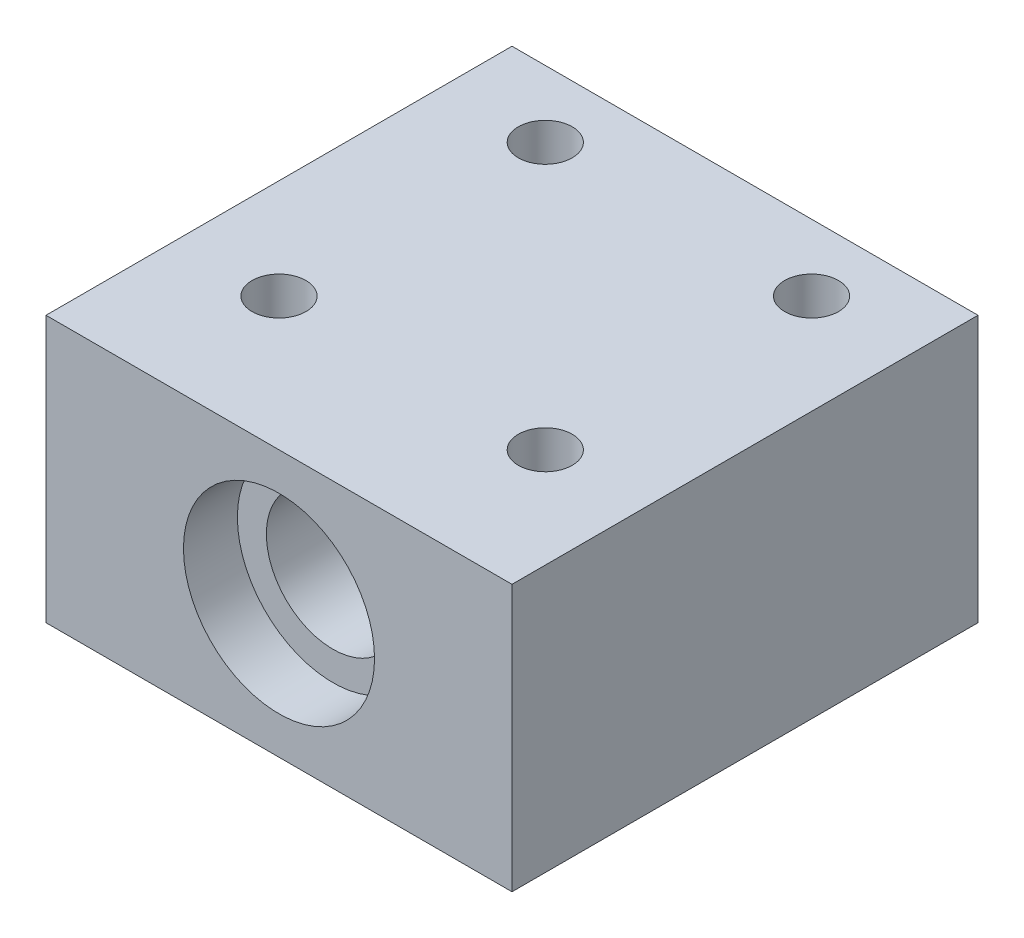
ISO-10303-21;
HEADER;
FILE_DESCRIPTION(('STEP AP214'),'2;1');
FILE_NAME('part.step','',(''),(''),'','','');
FILE_SCHEMA(('AUTOMOTIVE_DESIGN { 1 0 10303 214 1 1 1 1 }'));
ENDSEC;
DATA;
#1=APPLICATION_CONTEXT('core data for automotive mechanical design processes');
#2=APPLICATION_PROTOCOL_DEFINITION('international standard','automotive_design',2000,#1);
#3=PRODUCT_CONTEXT('',#1,'mechanical');
#4=PRODUCT('Part','Part','',(#3));
#5=PRODUCT_RELATED_PRODUCT_CATEGORY('part','',(#4));
#6=PRODUCT_DEFINITION_FORMATION('','',#4);
#7=PRODUCT_DEFINITION_CONTEXT('part definition',#1,'design');
#8=PRODUCT_DEFINITION('design','',#6,#7);
#9=PRODUCT_DEFINITION_SHAPE('','',#8);
#10=(LENGTH_UNIT() NAMED_UNIT(*) SI_UNIT(.MILLI.,.METRE.));
#11=(NAMED_UNIT(*) PLANE_ANGLE_UNIT() SI_UNIT($,.RADIAN.));
#12=(NAMED_UNIT(*) SI_UNIT($,.STERADIAN.) SOLID_ANGLE_UNIT());
#13=UNCERTAINTY_MEASURE_WITH_UNIT(LENGTH_MEASURE(1.E-05),#10,'distance_accuracy_value','');
#14=(GEOMETRIC_REPRESENTATION_CONTEXT(3) GLOBAL_UNCERTAINTY_ASSIGNED_CONTEXT((#13)) GLOBAL_UNIT_ASSIGNED_CONTEXT((#10,
#11,#12)) REPRESENTATION_CONTEXT('',''));
#15=CARTESIAN_POINT('',(0.,0.,0.));
#16=DIRECTION('',(0.,0.,1.));
#17=DIRECTION('',(1.,0.,0.));
#18=AXIS2_PLACEMENT_3D('',#15,#16,#17);
#19=CARTESIAN_POINT('',(0.,0.,40.));
#20=DIRECTION('',(0.,0.,-1.));
#21=DIRECTION('',(-1.,0.,0.));
#22=AXIS2_PLACEMENT_3D('',#19,#20,#21);
#23=CYLINDRICAL_SURFACE('',#22,10.);
#24=CARTESIAN_POINT('',(0.,0.,-21.9));
#25=DIRECTION('',(0.,0.,1.));
#26=DIRECTION('',(1.,0.,0.));
#27=AXIS2_PLACEMENT_3D('',#24,#25,#26);
#28=CIRCLE('',#27,10.);
#29=CARTESIAN_POINT('',(10.,0.,-21.9));
#30=VERTEX_POINT('',#29);
#31=EDGE_CURVE('E37',#30,#30,#28,.T.);
#32=ORIENTED_EDGE('',*,*,#31,.F.);
#33=EDGE_LOOP('',(#32));
#34=FACE_BOUND('',#33,.T.);
#35=CARTESIAN_POINT('',(0.,0.,31.9));
#36=DIRECTION('',(0.,0.,1.));
#37=DIRECTION('',(1.,0.,0.));
#38=AXIS2_PLACEMENT_3D('',#35,#36,#37);
#39=CIRCLE('',#38,10.);
#40=CARTESIAN_POINT('',(10.,0.,31.9));
#41=VERTEX_POINT('',#40);
#42=EDGE_CURVE('E117',#41,#41,#39,.T.);
#43=ORIENTED_EDGE('',*,*,#42,.T.);
#44=EDGE_LOOP('',(#43));
#45=FACE_BOUND('',#44,.T.);
#46=ADVANCED_FACE('F33',(#34,#45),#23,.F.);
#47=CARTESIAN_POINT('',(0.,0.,40.));
#48=DIRECTION('',(0.,0.,1.));
#49=DIRECTION('',(1.,0.,0.));
#50=AXIS2_PLACEMENT_3D('',#47,#48,#49);
#51=PLANE('',#50);
#52=CARTESIAN_POINT('',(0.,0.,40.));
#53=DIRECTION('',(0.,0.,1.));
#54=DIRECTION('',(1.,0.,0.));
#55=AXIS2_PLACEMENT_3D('',#52,#53,#54);
#56=CIRCLE('',#55,14.35);
#57=CARTESIAN_POINT('',(14.35,0.,40.));
#58=VERTEX_POINT('',#57);
#59=EDGE_CURVE('E132',#58,#58,#56,.T.);
#60=ORIENTED_EDGE('',*,*,#59,.F.);
#61=EDGE_LOOP('',(#60));
#62=FACE_BOUND('',#61,.T.);
#63=DIRECTION('',(0.,-1.,0.));
#64=VECTOR('',#63,1.);
#65=CARTESIAN_POINT('',(-35.,20.,40.));
#66=LINE('',#65,#64);
#67=CARTESIAN_POINT('',(-35.,20.,40.));
#68=VERTEX_POINT('',#67);
#69=CARTESIAN_POINT('',(-35.,-20.,40.));
#70=VERTEX_POINT('',#69);
#71=EDGE_CURVE('E104',#68,#70,#66,.T.);
#72=ORIENTED_EDGE('',*,*,#71,.T.);
#73=DIRECTION('',(1.,0.,0.));
#74=VECTOR('',#73,1.);
#75=CARTESIAN_POINT('',(-35.,-20.,40.));
#76=LINE('',#75,#74);
#77=CARTESIAN_POINT('',(35.,-20.,40.));
#78=VERTEX_POINT('',#77);
#79=EDGE_CURVE('E79',#70,#78,#76,.T.);
#80=ORIENTED_EDGE('',*,*,#79,.T.);
#81=DIRECTION('',(0.,1.,0.));
#82=VECTOR('',#81,1.);
#83=CARTESIAN_POINT('',(35.,20.,40.));
#84=LINE('',#83,#82);
#85=CARTESIAN_POINT('',(35.,20.,40.));
#86=VERTEX_POINT('',#85);
#87=EDGE_CURVE('E55',#78,#86,#84,.T.);
#88=ORIENTED_EDGE('',*,*,#87,.T.);
#89=DIRECTION('',(-1.,0.,0.));
#90=VECTOR('',#89,1.);
#91=CARTESIAN_POINT('',(-35.,20.,40.));
#92=LINE('',#91,#90);
#93=EDGE_CURVE('E50',#86,#68,#92,.T.);
#94=ORIENTED_EDGE('',*,*,#93,.T.);
#95=EDGE_LOOP('',(#72,#80,#88,#94));
#96=FACE_BOUND('',#95,.T.);
#97=ADVANCED_FACE('F174',(#62,#96),#51,.T.);
#98=CARTESIAN_POINT('',(-35.,20.,40.));
#99=DIRECTION('',(1.,0.,0.));
#100=DIRECTION('',(0.,1.,0.));
#101=AXIS2_PLACEMENT_3D('',#98,#99,#100);
#102=PLANE('',#101);
#103=DIRECTION('',(0.,0.,-1.));
#104=VECTOR('',#103,1.);
#105=CARTESIAN_POINT('',(-35.,20.,40.));
#106=LINE('',#105,#104);
#107=CARTESIAN_POINT('',(-35.,20.,-30.));
#108=VERTEX_POINT('',#107);
#109=EDGE_CURVE('E93',#68,#108,#106,.T.);
#110=ORIENTED_EDGE('',*,*,#109,.T.);
#111=DIRECTION('',(0.,-1.,0.));
#112=VECTOR('',#111,1.);
#113=CARTESIAN_POINT('',(-35.,20.,-30.));
#114=LINE('',#113,#112);
#115=CARTESIAN_POINT('',(-35.,-20.,-30.));
#116=VERTEX_POINT('',#115);
#117=EDGE_CURVE('E88',#108,#116,#114,.T.);
#118=ORIENTED_EDGE('',*,*,#117,.T.);
#119=DIRECTION('',(0.,0.,-1.));
#120=VECTOR('',#119,1.);
#121=CARTESIAN_POINT('',(-35.,-20.,40.));
#122=LINE('',#121,#120);
#123=EDGE_CURVE('E11',#70,#116,#122,.T.);
#124=ORIENTED_EDGE('',*,*,#123,.F.);
#125=ORIENTED_EDGE('',*,*,#71,.F.);
#126=EDGE_LOOP('',(#110,#118,#124,#125));
#127=FACE_BOUND('',#126,.T.);
#128=ADVANCED_FACE('F35',(#127),#102,.F.);
#129=CARTESIAN_POINT('',(-35.,-20.,40.));
#130=DIRECTION('',(0.,1.,0.));
#131=DIRECTION('',(-1.,0.,0.));
#132=AXIS2_PLACEMENT_3D('',#129,#130,#131);
#133=PLANE('',#132);
#134=CARTESIAN_POINT('',(20.,-20.,-20.));
#135=DIRECTION('',(0.,1.,0.));
#136=DIRECTION('',(-1.,0.,0.));
#137=AXIS2_PLACEMENT_3D('',#134,#135,#136);
#138=CIRCLE('',#137,4.05);
#139=CARTESIAN_POINT('',(15.95,-20.,-20.));
#140=VERTEX_POINT('',#139);
#141=EDGE_CURVE('E94',#140,#140,#138,.F.);
#142=ORIENTED_EDGE('',*,*,#141,.F.);
#143=EDGE_LOOP('',(#142));
#144=FACE_BOUND('',#143,.T.);
#145=CARTESIAN_POINT('',(-20.,-20.,20.));
#146=DIRECTION('',(0.,1.,0.));
#147=DIRECTION('',(-1.,0.,0.));
#148=AXIS2_PLACEMENT_3D('',#145,#146,#147);
#149=CIRCLE('',#148,4.05);
#150=CARTESIAN_POINT('',(-24.05,-20.,20.));
#151=VERTEX_POINT('',#150);
#152=EDGE_CURVE('E125',#151,#151,#149,.F.);
#153=ORIENTED_EDGE('',*,*,#152,.F.);
#154=EDGE_LOOP('',(#153));
#155=FACE_BOUND('',#154,.T.);
#156=CARTESIAN_POINT('',(20.,-20.,20.));
#157=DIRECTION('',(0.,1.,0.));
#158=DIRECTION('',(-1.,0.,0.));
#159=AXIS2_PLACEMENT_3D('',#156,#157,#158);
#160=CIRCLE('',#159,4.05);
#161=CARTESIAN_POINT('',(15.95,-20.,20.));
#162=VERTEX_POINT('',#161);
#163=EDGE_CURVE('E121',#162,#162,#160,.F.);
#164=ORIENTED_EDGE('',*,*,#163,.F.);
#165=EDGE_LOOP('',(#164));
#166=FACE_BOUND('',#165,.T.);
#167=CARTESIAN_POINT('',(-20.,-20.,-20.));
#168=DIRECTION('',(0.,1.,0.));
#169=DIRECTION('',(-1.,0.,0.));
#170=AXIS2_PLACEMENT_3D('',#167,#168,#169);
#171=CIRCLE('',#170,4.05);
#172=CARTESIAN_POINT('',(-24.05,-20.,-20.));
#173=VERTEX_POINT('',#172);
#174=EDGE_CURVE('E116',#173,#173,#171,.F.);
#175=ORIENTED_EDGE('',*,*,#174,.F.);
#176=EDGE_LOOP('',(#175));
#177=FACE_BOUND('',#176,.T.);
#178=ORIENTED_EDGE('',*,*,#123,.T.);
#179=DIRECTION('',(1.,0.,0.));
#180=VECTOR('',#179,1.);
#181=CARTESIAN_POINT('',(-35.,-20.,-30.));
#182=LINE('',#181,#180);
#183=CARTESIAN_POINT('',(35.,-20.,-30.));
#184=VERTEX_POINT('',#183);
#185=EDGE_CURVE('E78',#116,#184,#182,.T.);
#186=ORIENTED_EDGE('',*,*,#185,.T.);
#187=DIRECTION('',(0.,0.,-1.));
#188=VECTOR('',#187,1.);
#189=CARTESIAN_POINT('',(35.,-20.,40.));
#190=LINE('',#189,#188);
#191=EDGE_CURVE('E42',#78,#184,#190,.T.);
#192=ORIENTED_EDGE('',*,*,#191,.F.);
#193=ORIENTED_EDGE('',*,*,#79,.F.);
#194=EDGE_LOOP('',(#178,#186,#192,#193));
#195=FACE_BOUND('',#194,.T.);
#196=ADVANCED_FACE('F76',(#144,#155,#166,#177,#195),#133,.F.);
#197=CARTESIAN_POINT('',(35.,20.,40.));
#198=DIRECTION('',(-1.,0.,0.));
#199=DIRECTION('',(0.,-1.,0.));
#200=AXIS2_PLACEMENT_3D('',#197,#198,#199);
#201=PLANE('',#200);
#202=ORIENTED_EDGE('',*,*,#191,.T.);
#203=DIRECTION('',(0.,1.,0.));
#204=VECTOR('',#203,1.);
#205=CARTESIAN_POINT('',(35.,20.,-30.));
#206=LINE('',#205,#204);
#207=CARTESIAN_POINT('',(35.,20.,-30.));
#208=VERTEX_POINT('',#207);
#209=EDGE_CURVE('E91',#184,#208,#206,.T.);
#210=ORIENTED_EDGE('',*,*,#209,.T.);
#211=DIRECTION('',(0.,0.,-1.));
#212=VECTOR('',#211,1.);
#213=CARTESIAN_POINT('',(35.,20.,40.));
#214=LINE('',#213,#212);
#215=EDGE_CURVE('E110',#86,#208,#214,.T.);
#216=ORIENTED_EDGE('',*,*,#215,.F.);
#217=ORIENTED_EDGE('',*,*,#87,.F.);
#218=EDGE_LOOP('',(#202,#210,#216,#217));
#219=FACE_BOUND('',#218,.T.);
#220=ADVANCED_FACE('F152',(#219),#201,.F.);
#221=CARTESIAN_POINT('',(-35.,20.,40.));
#222=DIRECTION('',(0.,-1.,0.));
#223=DIRECTION('',(1.,0.,0.));
#224=AXIS2_PLACEMENT_3D('',#221,#222,#223);
#225=PLANE('',#224);
#226=CARTESIAN_POINT('',(20.,20.,-20.));
#227=DIRECTION('',(0.,-1.,0.));
#228=DIRECTION('',(1.,0.,0.));
#229=AXIS2_PLACEMENT_3D('',#226,#227,#228);
#230=CIRCLE('',#229,4.05);
#231=CARTESIAN_POINT('',(24.05,20.,-20.));
#232=VERTEX_POINT('',#231);
#233=EDGE_CURVE('E97',#232,#232,#230,.F.);
#234=ORIENTED_EDGE('',*,*,#233,.F.);
#235=EDGE_LOOP('',(#234));
#236=FACE_BOUND('',#235,.T.);
#237=CARTESIAN_POINT('',(-20.,20.,20.));
#238=DIRECTION('',(0.,-1.,0.));
#239=DIRECTION('',(1.,0.,0.));
#240=AXIS2_PLACEMENT_3D('',#237,#238,#239);
#241=CIRCLE('',#240,4.05);
#242=CARTESIAN_POINT('',(-15.95,20.,20.));
#243=VERTEX_POINT('',#242);
#244=EDGE_CURVE('E122',#243,#243,#241,.F.);
#245=ORIENTED_EDGE('',*,*,#244,.F.);
#246=EDGE_LOOP('',(#245));
#247=FACE_BOUND('',#246,.T.);
#248=CARTESIAN_POINT('',(20.,20.,20.));
#249=DIRECTION('',(0.,-1.,0.));
#250=DIRECTION('',(1.,0.,0.));
#251=AXIS2_PLACEMENT_3D('',#248,#249,#250);
#252=CIRCLE('',#251,4.05);
#253=CARTESIAN_POINT('',(24.05,20.,20.));
#254=VERTEX_POINT('',#253);
#255=EDGE_CURVE('E118',#254,#254,#252,.F.);
#256=ORIENTED_EDGE('',*,*,#255,.F.);
#257=EDGE_LOOP('',(#256));
#258=FACE_BOUND('',#257,.T.);
#259=CARTESIAN_POINT('',(-20.,20.,-20.));
#260=DIRECTION('',(0.,-1.,0.));
#261=DIRECTION('',(1.,0.,0.));
#262=AXIS2_PLACEMENT_3D('',#259,#260,#261);
#263=CIRCLE('',#262,4.05);
#264=CARTESIAN_POINT('',(-15.95,20.,-20.));
#265=VERTEX_POINT('',#264);
#266=EDGE_CURVE('E113',#265,#265,#263,.F.);
#267=ORIENTED_EDGE('',*,*,#266,.F.);
#268=EDGE_LOOP('',(#267));
#269=FACE_BOUND('',#268,.T.);
#270=ORIENTED_EDGE('',*,*,#215,.T.);
#271=DIRECTION('',(-1.,0.,0.));
#272=VECTOR('',#271,1.);
#273=CARTESIAN_POINT('',(-35.,20.,-30.));
#274=LINE('',#273,#272);
#275=EDGE_CURVE('E102',#208,#108,#274,.T.);
#276=ORIENTED_EDGE('',*,*,#275,.T.);
#277=ORIENTED_EDGE('',*,*,#109,.F.);
#278=ORIENTED_EDGE('',*,*,#93,.F.);
#279=EDGE_LOOP('',(#270,#276,#277,#278));
#280=FACE_BOUND('',#279,.T.);
#281=ADVANCED_FACE('F169',(#236,#247,#258,#269,#280),#225,.F.);
#282=CARTESIAN_POINT('',(0.,0.,-30.));
#283=DIRECTION('',(0.,0.,1.));
#284=DIRECTION('',(1.,0.,0.));
#285=AXIS2_PLACEMENT_3D('',#282,#283,#284);
#286=PLANE('',#285);
#287=CARTESIAN_POINT('',(0.,0.,-30.));
#288=DIRECTION('',(0.,0.,1.));
#289=DIRECTION('',(1.,0.,0.));
#290=AXIS2_PLACEMENT_3D('',#287,#288,#289);
#291=CIRCLE('',#290,14.2875);
#292=CARTESIAN_POINT('',(14.2875,0.,-30.));
#293=VERTEX_POINT('',#292);
#294=EDGE_CURVE('E139',#293,#293,#291,.T.);
#295=ORIENTED_EDGE('',*,*,#294,.T.);
#296=EDGE_LOOP('',(#295));
#297=FACE_BOUND('',#296,.T.);
#298=ORIENTED_EDGE('',*,*,#117,.F.);
#299=ORIENTED_EDGE('',*,*,#275,.F.);
#300=ORIENTED_EDGE('',*,*,#209,.F.);
#301=ORIENTED_EDGE('',*,*,#185,.F.);
#302=EDGE_LOOP('',(#298,#299,#300,#301));
#303=FACE_BOUND('',#302,.T.);
#304=ADVANCED_FACE('F86',(#297,#303),#286,.F.);
#305=CARTESIAN_POINT('',(-20.,25.,-20.));
#306=DIRECTION('',(0.,-1.,0.));
#307=DIRECTION('',(0.,0.,-1.));
#308=AXIS2_PLACEMENT_3D('',#305,#306,#307);
#309=CYLINDRICAL_SURFACE('',#308,4.05);
#310=ORIENTED_EDGE('',*,*,#266,.T.);
#311=EDGE_LOOP('',(#310));
#312=FACE_BOUND('',#311,.T.);
#313=ORIENTED_EDGE('',*,*,#174,.T.);
#314=EDGE_LOOP('',(#313));
#315=FACE_BOUND('',#314,.T.);
#316=ADVANCED_FACE('F158',(#312,#315),#309,.F.);
#317=CARTESIAN_POINT('',(20.,25.,20.));
#318=DIRECTION('',(0.,-1.,0.));
#319=DIRECTION('',(0.,0.,-1.));
#320=AXIS2_PLACEMENT_3D('',#317,#318,#319);
#321=CYLINDRICAL_SURFACE('',#320,4.05);
#322=ORIENTED_EDGE('',*,*,#255,.T.);
#323=EDGE_LOOP('',(#322));
#324=FACE_BOUND('',#323,.T.);
#325=ORIENTED_EDGE('',*,*,#163,.T.);
#326=EDGE_LOOP('',(#325));
#327=FACE_BOUND('',#326,.T.);
#328=ADVANCED_FACE('F160',(#324,#327),#321,.F.);
#329=CARTESIAN_POINT('',(-20.,25.,20.));
#330=DIRECTION('',(0.,-1.,0.));
#331=DIRECTION('',(0.,0.,-1.));
#332=AXIS2_PLACEMENT_3D('',#329,#330,#331);
#333=CYLINDRICAL_SURFACE('',#332,4.05);
#334=ORIENTED_EDGE('',*,*,#244,.T.);
#335=EDGE_LOOP('',(#334));
#336=FACE_BOUND('',#335,.T.);
#337=ORIENTED_EDGE('',*,*,#152,.T.);
#338=EDGE_LOOP('',(#337));
#339=FACE_BOUND('',#338,.T.);
#340=ADVANCED_FACE('F148',(#336,#339),#333,.F.);
#341=CARTESIAN_POINT('',(20.,25.,-20.));
#342=DIRECTION('',(0.,-1.,0.));
#343=DIRECTION('',(0.,0.,-1.));
#344=AXIS2_PLACEMENT_3D('',#341,#342,#343);
#345=CYLINDRICAL_SURFACE('',#344,4.05);
#346=ORIENTED_EDGE('',*,*,#233,.T.);
#347=EDGE_LOOP('',(#346));
#348=FACE_BOUND('',#347,.T.);
#349=ORIENTED_EDGE('',*,*,#141,.T.);
#350=EDGE_LOOP('',(#349));
#351=FACE_BOUND('',#350,.T.);
#352=ADVANCED_FACE('F242',(#348,#351),#345,.F.);
#353=CARTESIAN_POINT('',(0.,0.,31.9));
#354=DIRECTION('',(0.,0.,1.));
#355=DIRECTION('',(1.,0.,0.));
#356=AXIS2_PLACEMENT_3D('',#353,#354,#355);
#357=CYLINDRICAL_SURFACE('',#356,14.35);
#358=CARTESIAN_POINT('',(0.,0.,31.9));
#359=DIRECTION('',(0.,0.,1.));
#360=DIRECTION('',(1.,0.,0.));
#361=AXIS2_PLACEMENT_3D('',#358,#359,#360);
#362=CIRCLE('',#361,14.35);
#363=CARTESIAN_POINT('',(14.35,0.,31.9));
#364=VERTEX_POINT('',#363);
#365=EDGE_CURVE('E128',#364,#364,#362,.T.);
#366=ORIENTED_EDGE('',*,*,#365,.F.);
#367=EDGE_LOOP('',(#366));
#368=FACE_BOUND('',#367,.T.);
#369=ORIENTED_EDGE('',*,*,#59,.T.);
#370=EDGE_LOOP('',(#369));
#371=FACE_BOUND('',#370,.T.);
#372=ADVANCED_FACE('F239',(#368,#371),#357,.F.);
#373=CARTESIAN_POINT('',(0.,0.,31.9));
#374=DIRECTION('',(0.,0.,1.));
#375=DIRECTION('',(1.,0.,0.));
#376=AXIS2_PLACEMENT_3D('',#373,#374,#375);
#377=PLANE('',#376);
#378=ORIENTED_EDGE('',*,*,#42,.F.);
#379=EDGE_LOOP('',(#378));
#380=FACE_BOUND('',#379,.T.);
#381=ORIENTED_EDGE('',*,*,#365,.T.);
#382=EDGE_LOOP('',(#381));
#383=FACE_BOUND('',#382,.T.);
#384=ADVANCED_FACE('F219',(#380,#383),#377,.T.);
#385=CARTESIAN_POINT('',(0.,0.,-21.9));
#386=DIRECTION('',(0.,0.,-1.));
#387=DIRECTION('',(-1.,0.,0.));
#388=AXIS2_PLACEMENT_3D('',#385,#386,#387);
#389=CYLINDRICAL_SURFACE('',#388,14.2875);
#390=CARTESIAN_POINT('',(0.,0.,-21.9));
#391=DIRECTION('',(0.,0.,1.));
#392=DIRECTION('',(1.,0.,0.));
#393=AXIS2_PLACEMENT_3D('',#390,#391,#392);
#394=CIRCLE('',#393,14.2875);
#395=CARTESIAN_POINT('',(14.2875,0.,-21.9));
#396=VERTEX_POINT('',#395);
#397=EDGE_CURVE('E315',#396,#396,#394,.T.);
#398=ORIENTED_EDGE('',*,*,#397,.T.);
#399=EDGE_LOOP('',(#398));
#400=FACE_BOUND('',#399,.T.);
#401=ORIENTED_EDGE('',*,*,#294,.F.);
#402=EDGE_LOOP('',(#401));
#403=FACE_BOUND('',#402,.T.);
#404=ADVANCED_FACE('F213',(#400,#403),#389,.F.);
#405=CARTESIAN_POINT('',(0.,0.,-21.9));
#406=DIRECTION('',(0.,0.,1.));
#407=DIRECTION('',(1.,0.,0.));
#408=AXIS2_PLACEMENT_3D('',#405,#406,#407);
#409=PLANE('',#408);
#410=ORIENTED_EDGE('',*,*,#31,.T.);
#411=EDGE_LOOP('',(#410));
#412=FACE_BOUND('',#411,.T.);
#413=ORIENTED_EDGE('',*,*,#397,.F.);
#414=EDGE_LOOP('',(#413));
#415=FACE_BOUND('',#414,.T.);
#416=ADVANCED_FACE('F218',(#412,#415),#409,.F.);
#417=CLOSED_SHELL('',(#46,#97,#128,#196,#220,#281,#304,#316,#328,#340,#352,#372,#384,#404,#416));
#418=MANIFOLD_SOLID_BREP('B2',#417);
#419=ADVANCED_BREP_SHAPE_REPRESENTATION('',(#18,#418),#14);
#420=SHAPE_DEFINITION_REPRESENTATION(#9,#419);
ENDSEC;
END-ISO-10303-21;
